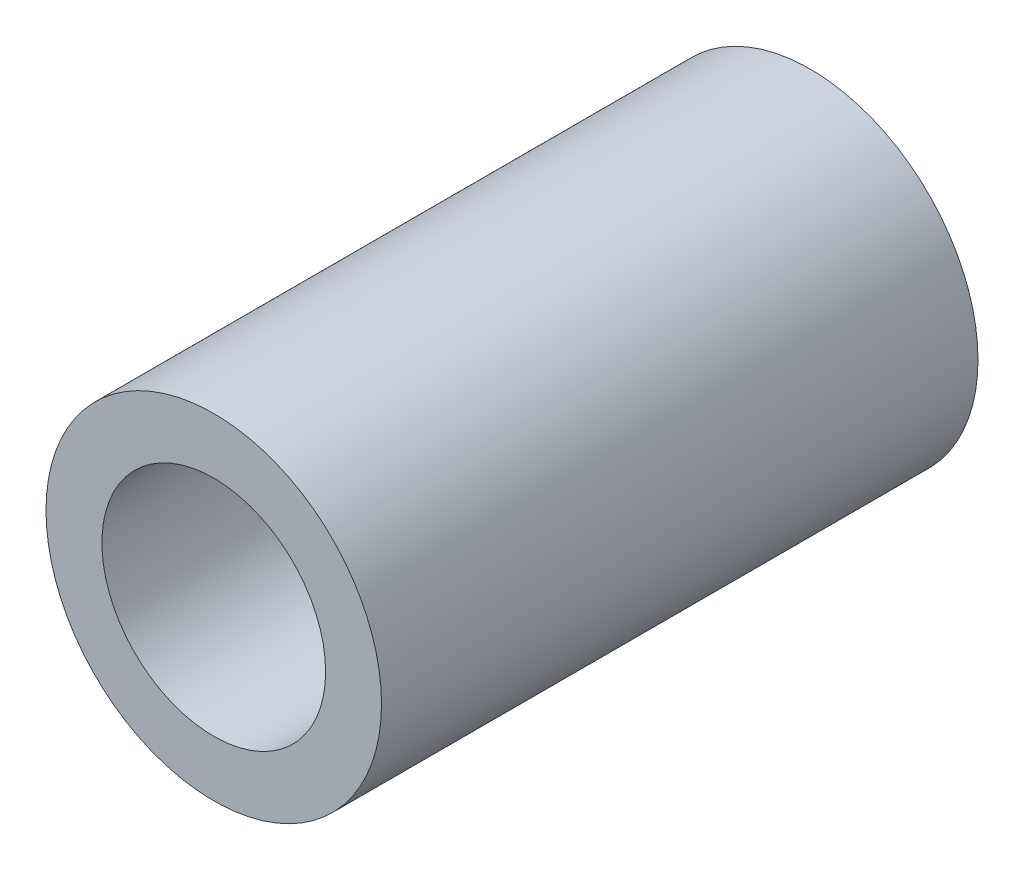
ISO-10303-21;
HEADER;
FILE_DESCRIPTION(('STEP AP214'),'2;1');
FILE_NAME('part.step','',(''),(''),'','','');
FILE_SCHEMA(('AUTOMOTIVE_DESIGN { 1 0 10303 214 1 1 1 1 }'));
ENDSEC;
DATA;
#1=APPLICATION_CONTEXT('core data for automotive mechanical design processes');
#2=APPLICATION_PROTOCOL_DEFINITION('international standard','automotive_design',2000,#1);
#3=PRODUCT_CONTEXT('',#1,'mechanical');
#4=PRODUCT('Part','Part','',(#3));
#5=PRODUCT_RELATED_PRODUCT_CATEGORY('part','',(#4));
#6=PRODUCT_DEFINITION_FORMATION('','',#4);
#7=PRODUCT_DEFINITION_CONTEXT('part definition',#1,'design');
#8=PRODUCT_DEFINITION('design','',#6,#7);
#9=PRODUCT_DEFINITION_SHAPE('','',#8);
#10=(LENGTH_UNIT() NAMED_UNIT(*) SI_UNIT(.MILLI.,.METRE.));
#11=(NAMED_UNIT(*) PLANE_ANGLE_UNIT() SI_UNIT($,.RADIAN.));
#12=(NAMED_UNIT(*) SI_UNIT($,.STERADIAN.) SOLID_ANGLE_UNIT());
#13=UNCERTAINTY_MEASURE_WITH_UNIT(LENGTH_MEASURE(1.E-05),#10,'distance_accuracy_value','');
#14=(GEOMETRIC_REPRESENTATION_CONTEXT(3) GLOBAL_UNCERTAINTY_ASSIGNED_CONTEXT((#13)) GLOBAL_UNIT_ASSIGNED_CONTEXT((#10,
#11,#12)) REPRESENTATION_CONTEXT('',''));
#15=CARTESIAN_POINT('',(0.,0.,0.));
#16=DIRECTION('',(0.,0.,1.));
#17=DIRECTION('',(1.,0.,0.));
#18=AXIS2_PLACEMENT_3D('',#15,#16,#17);
#19=CARTESIAN_POINT('',(0.,0.,16.));
#20=DIRECTION('',(0.,0.,1.));
#21=DIRECTION('',(1.,0.,0.));
#22=AXIS2_PLACEMENT_3D('',#19,#20,#21);
#23=PLANE('',#22);
#24=CARTESIAN_POINT('',(0.,0.,16.));
#25=DIRECTION('',(0.,0.,1.));
#26=DIRECTION('',(1.,0.,0.));
#27=AXIS2_PLACEMENT_3D('',#24,#25,#26);
#28=CIRCLE('',#27,4.5);
#29=CARTESIAN_POINT('',(4.5,0.,16.));
#30=VERTEX_POINT('',#29);
#31=EDGE_CURVE('E10',#30,#30,#28,.T.);
#32=ORIENTED_EDGE('',*,*,#31,.T.);
#33=EDGE_LOOP('',(#32));
#34=FACE_BOUND('',#33,.T.);
#35=CARTESIAN_POINT('',(0.,0.,16.));
#36=DIRECTION('',(0.,0.,1.));
#37=DIRECTION('',(1.,0.,0.));
#38=AXIS2_PLACEMENT_3D('',#35,#36,#37);
#39=CIRCLE('',#38,3.);
#40=CARTESIAN_POINT('',(3.,0.,16.));
#41=VERTEX_POINT('',#40);
#42=EDGE_CURVE('E50',#41,#41,#39,.T.);
#43=ORIENTED_EDGE('',*,*,#42,.F.);
#44=EDGE_LOOP('',(#43));
#45=FACE_BOUND('',#44,.T.);
#46=ADVANCED_FACE('F39',(#34,#45),#23,.T.);
#47=CARTESIAN_POINT('',(0.,0.,0.));
#48=DIRECTION('',(0.,0.,1.));
#49=DIRECTION('',(1.,0.,0.));
#50=AXIS2_PLACEMENT_3D('',#47,#48,#49);
#51=PLANE('',#50);
#52=CARTESIAN_POINT('',(0.,0.,0.));
#53=DIRECTION('',(0.,0.,1.));
#54=DIRECTION('',(1.,0.,0.));
#55=AXIS2_PLACEMENT_3D('',#52,#53,#54);
#56=CIRCLE('',#55,4.5);
#57=CARTESIAN_POINT('',(4.5,0.,0.));
#58=VERTEX_POINT('',#57);
#59=EDGE_CURVE('E43',#58,#58,#56,.T.);
#60=ORIENTED_EDGE('',*,*,#59,.F.);
#61=EDGE_LOOP('',(#60));
#62=FACE_BOUND('',#61,.T.);
#63=CARTESIAN_POINT('',(0.,0.,0.));
#64=DIRECTION('',(0.,0.,1.));
#65=DIRECTION('',(1.,0.,0.));
#66=AXIS2_PLACEMENT_3D('',#63,#64,#65);
#67=CIRCLE('',#66,3.);
#68=CARTESIAN_POINT('',(3.,0.,0.));
#69=VERTEX_POINT('',#68);
#70=EDGE_CURVE('E52',#69,#69,#67,.T.);
#71=ORIENTED_EDGE('',*,*,#70,.T.);
#72=EDGE_LOOP('',(#71));
#73=FACE_BOUND('',#72,.T.);
#74=ADVANCED_FACE('F62',(#62,#73),#51,.F.);
#75=CARTESIAN_POINT('',(0.,0.,16.));
#76=DIRECTION('',(0.,0.,-1.));
#77=DIRECTION('',(-1.,0.,0.));
#78=AXIS2_PLACEMENT_3D('',#75,#76,#77);
#79=CYLINDRICAL_SURFACE('',#78,4.5);
#80=ORIENTED_EDGE('',*,*,#31,.F.);
#81=EDGE_LOOP('',(#80));
#82=FACE_BOUND('',#81,.T.);
#83=ORIENTED_EDGE('',*,*,#59,.T.);
#84=EDGE_LOOP('',(#83));
#85=FACE_BOUND('',#84,.T.);
#86=ADVANCED_FACE('F41',(#82,#85),#79,.T.);
#87=CARTESIAN_POINT('',(0.,0.,16.));
#88=DIRECTION('',(0.,0.,-1.));
#89=DIRECTION('',(-1.,0.,0.));
#90=AXIS2_PLACEMENT_3D('',#87,#88,#89);
#91=CYLINDRICAL_SURFACE('',#90,3.);
#92=ORIENTED_EDGE('',*,*,#42,.T.);
#93=EDGE_LOOP('',(#92));
#94=FACE_BOUND('',#93,.T.);
#95=ORIENTED_EDGE('',*,*,#70,.F.);
#96=EDGE_LOOP('',(#95));
#97=FACE_BOUND('',#96,.T.);
#98=ADVANCED_FACE('F58',(#94,#97),#91,.F.);
#99=CLOSED_SHELL('',(#46,#74,#86,#98));
#100=MANIFOLD_SOLID_BREP('B2',#99);
#101=ADVANCED_BREP_SHAPE_REPRESENTATION('',(#18,#100),#14);
#102=SHAPE_DEFINITION_REPRESENTATION(#9,#101);
ENDSEC;
END-ISO-10303-21;
